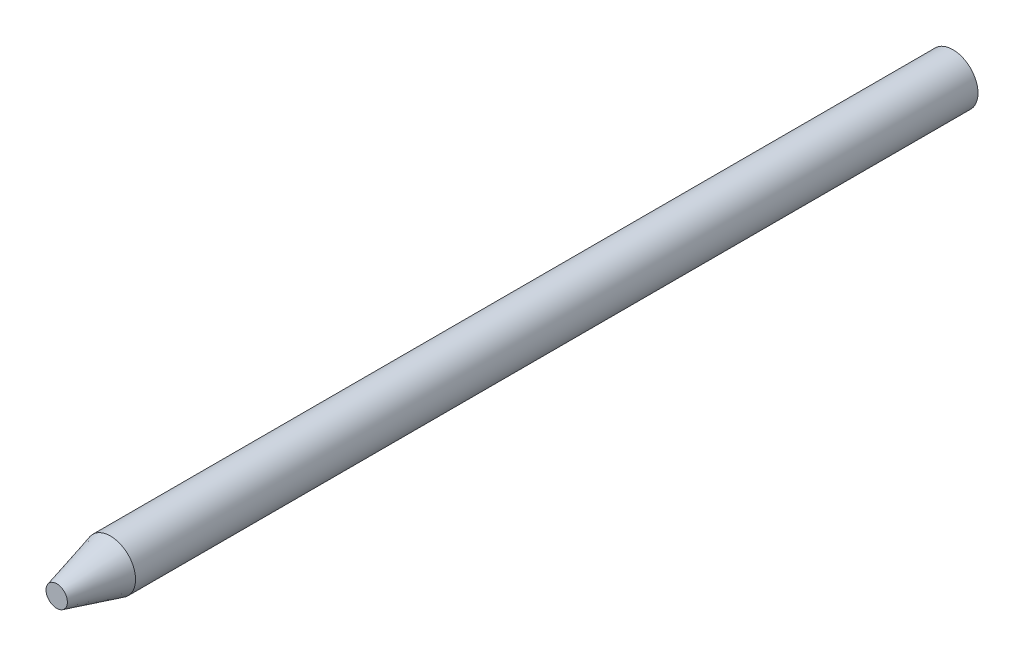
ISO-10303-21;
HEADER;
FILE_DESCRIPTION(('STEP AP214'),'2;1');
FILE_NAME('part.step','',(''),(''),'','','');
FILE_SCHEMA(('AUTOMOTIVE_DESIGN { 1 0 10303 214 1 1 1 1 }'));
ENDSEC;
DATA;
#1=APPLICATION_CONTEXT('core data for automotive mechanical design processes');
#2=APPLICATION_PROTOCOL_DEFINITION('international standard','automotive_design',2000,#1);
#3=PRODUCT_CONTEXT('',#1,'mechanical');
#4=PRODUCT('Part','Part','',(#3));
#5=PRODUCT_RELATED_PRODUCT_CATEGORY('part','',(#4));
#6=PRODUCT_DEFINITION_FORMATION('','',#4);
#7=PRODUCT_DEFINITION_CONTEXT('part definition',#1,'design');
#8=PRODUCT_DEFINITION('design','',#6,#7);
#9=PRODUCT_DEFINITION_SHAPE('','',#8);
#10=(LENGTH_UNIT() NAMED_UNIT(*) SI_UNIT(.MILLI.,.METRE.));
#11=(NAMED_UNIT(*) PLANE_ANGLE_UNIT() SI_UNIT($,.RADIAN.));
#12=(NAMED_UNIT(*) SI_UNIT($,.STERADIAN.) SOLID_ANGLE_UNIT());
#13=UNCERTAINTY_MEASURE_WITH_UNIT(LENGTH_MEASURE(1.E-05),#10,'distance_accuracy_value','');
#14=(GEOMETRIC_REPRESENTATION_CONTEXT(3) GLOBAL_UNCERTAINTY_ASSIGNED_CONTEXT((#13)) GLOBAL_UNIT_ASSIGNED_CONTEXT((#10,
#11,#12)) REPRESENTATION_CONTEXT('',''));
#15=CARTESIAN_POINT('',(0.,0.,0.));
#16=DIRECTION('',(0.,0.,1.));
#17=DIRECTION('',(1.,0.,0.));
#18=AXIS2_PLACEMENT_3D('',#15,#16,#17);
#19=CARTESIAN_POINT('',(0.,0.,63.5));
#20=DIRECTION('',(0.,0.,-1.));
#21=DIRECTION('',(-1.,0.,0.));
#22=AXIS2_PLACEMENT_3D('',#19,#20,#21);
#23=CYLINDRICAL_SURFACE('',#22,1.778);
#24=CARTESIAN_POINT('',(0.,0.,59.6899999999999));
#25=DIRECTION('',(0.,0.,1.));
#26=DIRECTION('',(1.,0.,0.));
#27=AXIS2_PLACEMENT_3D('',#24,#25,#26);
#28=CIRCLE('',#27,1.778);
#29=CARTESIAN_POINT('',(-1.778,0.,59.6899999999999));
#30=VERTEX_POINT('',#29);
#31=EDGE_CURVE('E10',#30,#30,#28,.F.);
#32=ORIENTED_EDGE('',*,*,#31,.T.);
#33=EDGE_LOOP('',(#32));
#34=FACE_BOUND('',#33,.T.);
#35=CARTESIAN_POINT('',(0.,0.,0.));
#36=DIRECTION('',(0.,0.,1.));
#37=DIRECTION('',(1.,0.,0.));
#38=AXIS2_PLACEMENT_3D('',#35,#36,#37);
#39=CIRCLE('',#38,1.778);
#40=CARTESIAN_POINT('',(1.778,0.,0.));
#41=VERTEX_POINT('',#40);
#42=EDGE_CURVE('E42',#41,#41,#39,.T.);
#43=ORIENTED_EDGE('',*,*,#42,.T.);
#44=EDGE_LOOP('',(#43));
#45=FACE_BOUND('',#44,.T.);
#46=ADVANCED_FACE('F31',(#34,#45),#23,.T.);
#47=CARTESIAN_POINT('',(0.,0.,63.5));
#48=DIRECTION('',(0.,0.,1.));
#49=DIRECTION('',(1.,0.,0.));
#50=AXIS2_PLACEMENT_3D('',#47,#48,#49);
#51=PLANE('',#50);
#52=CARTESIAN_POINT('',(0.,0.,63.5));
#53=DIRECTION('',(0.,0.,1.));
#54=DIRECTION('',(1.,0.,0.));
#55=AXIS2_PLACEMENT_3D('',#52,#53,#54);
#56=CIRCLE('',#55,0.757113576837398);
#57=CARTESIAN_POINT('',(-0.757113576837399,0.,63.5));
#58=VERTEX_POINT('',#57);
#59=EDGE_CURVE('E38',#58,#58,#56,.T.);
#60=ORIENTED_EDGE('',*,*,#59,.T.);
#61=EDGE_LOOP('',(#60));
#62=FACE_BOUND('',#61,.T.);
#63=ADVANCED_FACE('F52',(#62),#51,.T.);
#64=CARTESIAN_POINT('',(0.,0.,0.));
#65=DIRECTION('',(0.,0.,1.));
#66=DIRECTION('',(1.,0.,0.));
#67=AXIS2_PLACEMENT_3D('',#64,#65,#66);
#68=PLANE('',#67);
#69=ORIENTED_EDGE('',*,*,#42,.F.);
#70=EDGE_LOOP('',(#69));
#71=FACE_BOUND('',#70,.T.);
#72=ADVANCED_FACE('F50',(#71),#68,.F.);
#73=CARTESIAN_POINT('',(0.,0.,63.5));
#74=DIRECTION('',(0.,0.,-1.));
#75=DIRECTION('',(-1.,0.,0.));
#76=AXIS2_PLACEMENT_3D('',#73,#74,#75);
#77=CONICAL_SURFACE('',#76,0.757113576837398,0.261799387799147);
#78=CARTESIAN_POINT('',(-1.778,0.,59.6899999999999));
#79=CARTESIAN_POINT('',(-1.76736576642539,0.,59.7296874999999));
#80=CARTESIAN_POINT('',(-1.75673153285078,0.,59.7693749999999));
#81=CARTESIAN_POINT('',(-1.73546306570156,0.,59.8487499999999));
#82=CARTESIAN_POINT('',(-1.72482883212695,0.,59.8884374999999));
#83=CARTESIAN_POINT('',(-1.70356036497773,0.,59.9678124999999));
#84=CARTESIAN_POINT('',(-1.69292613140312,0.,60.0074999999999));
#85=CARTESIAN_POINT('',(-1.6716576642539,0.,60.0868749999999));
#86=CARTESIAN_POINT('',(-1.66102343067929,0.,60.1265624999999));
#87=CARTESIAN_POINT('',(-1.63975496353007,0.,60.2059374999999));
#88=CARTESIAN_POINT('',(-1.62912072995546,0.,60.2456249999999));
#89=CARTESIAN_POINT('',(-1.60785226280623,0.,60.3249999999999));
#90=CARTESIAN_POINT('',(-1.59721802923162,0.,60.3646874999999));
#91=CARTESIAN_POINT('',(-1.5759495620824,0.,60.4440624999999));
#92=CARTESIAN_POINT('',(-1.56531532850779,0.,60.4837499999999));
#93=CARTESIAN_POINT('',(-1.54404686135857,0.,60.5631249999999));
#94=CARTESIAN_POINT('',(-1.53341262778396,0.,60.6028124999999));
#95=CARTESIAN_POINT('',(-1.51214416063474,0.,60.6821874999999));
#96=CARTESIAN_POINT('',(-1.50150992706013,0.,60.7218749999999));
#97=CARTESIAN_POINT('',(-1.48024145991091,0.,60.8012499999999));
#98=CARTESIAN_POINT('',(-1.4696072263363,0.,60.8409374999999));
#99=CARTESIAN_POINT('',(-1.44833875918708,0.,60.9203124999999));
#100=CARTESIAN_POINT('',(-1.43770452561247,0.,60.9599999999999));
#101=CARTESIAN_POINT('',(-1.41643605846325,0.,61.0393749999999));
#102=CARTESIAN_POINT('',(-1.40580182488864,0.,61.0790624999999));
#103=CARTESIAN_POINT('',(-1.38453335773942,0.,61.1584374999999));
#104=CARTESIAN_POINT('',(-1.3738991241648,0.,61.1981249999999));
#105=CARTESIAN_POINT('',(-1.35263065701558,0.,61.2774999999999));
#106=CARTESIAN_POINT('',(-1.34199642344097,0.,61.3171874999999));
#107=CARTESIAN_POINT('',(-1.32072795629175,0.,61.3965624999999));
#108=CARTESIAN_POINT('',(-1.31009372271714,0.,61.4362499999999));
#109=CARTESIAN_POINT('',(-1.28882525556792,0.,61.5156249999999));
#110=CARTESIAN_POINT('',(-1.27819102199331,0.,61.5553124999999));
#111=CARTESIAN_POINT('',(-1.25692255484409,0.,61.6346874999999));
#112=CARTESIAN_POINT('',(-1.24628832126948,0.,61.6743749999999));
#113=CARTESIAN_POINT('',(-1.22501985412026,0.,61.7537499999999));
#114=CARTESIAN_POINT('',(-1.21438562054565,0.,61.7934374999999));
#115=CARTESIAN_POINT('',(-1.19311715339643,0.,61.8728124999999));
#116=CARTESIAN_POINT('',(-1.18248291982182,0.,61.9124999999999));
#117=CARTESIAN_POINT('',(-1.1612144526726,0.,61.9918749999999));
#118=CARTESIAN_POINT('',(-1.15058021909799,0.,62.0315624999999));
#119=CARTESIAN_POINT('',(-1.12931175194876,0.,62.1109374999999));
#120=CARTESIAN_POINT('',(-1.11867751837415,0.,62.1506249999999));
#121=CARTESIAN_POINT('',(-1.09740905122493,0.,62.23));
#122=CARTESIAN_POINT('',(-1.08677481765032,0.,62.2696875));
#123=CARTESIAN_POINT('',(-1.0655063505011,0.,62.3490625));
#124=CARTESIAN_POINT('',(-1.05487211692649,0.,62.38875));
#125=CARTESIAN_POINT('',(-1.03360364977727,0.,62.468125));
#126=CARTESIAN_POINT('',(-1.02296941620266,0.,62.5078125));
#127=CARTESIAN_POINT('',(-1.00170094905344,0.,62.5871875));
#128=CARTESIAN_POINT('',(-0.991066715478829,0.,62.626875));
#129=CARTESIAN_POINT('',(-0.969798248329608,0.,62.70625));
#130=CARTESIAN_POINT('',(-0.959164014754998,0.,62.7459375));
#131=CARTESIAN_POINT('',(-0.937895547605777,0.,62.8253125));
#132=CARTESIAN_POINT('',(-0.927261314031166,0.,62.865));
#133=CARTESIAN_POINT('',(-0.905992846881945,0.,62.944375));
#134=CARTESIAN_POINT('',(-0.895358613307335,0.,62.9840625));
#135=CARTESIAN_POINT('',(-0.874090146158114,0.,63.0634375));
#136=CARTESIAN_POINT('',(-0.863455912583504,0.,63.103125));
#137=CARTESIAN_POINT('',(-0.842187445434283,0.,63.1825));
#138=CARTESIAN_POINT('',(-0.831553211859672,0.,63.2221875));
#139=CARTESIAN_POINT('',(-0.810284744710451,0.,63.3015625));
#140=CARTESIAN_POINT('',(-0.799650511135841,0.,63.34125));
#141=CARTESIAN_POINT('',(-0.778382043986619,0.,63.420625));
#142=CARTESIAN_POINT('',(-0.767747810412009,0.,63.4603125));
#143=CARTESIAN_POINT('',(-0.757113576837399,0.,63.5));
#144=B_SPLINE_CURVE_WITH_KNOTS('',3,(#78,#79,#80,#81,#82,#83,#84,#85,#86,#87,#88,#89,#90,#91,
#92,#93,#94,#95,#96,#97,#98,#99,#100,#101,#102,#103,#104,#105,#106,#107,#108,#109,#110,#111,
#112,#113,#114,#115,#116,#117,#118,#119,#120,#121,#122,#123,#124,#125,#126,#127,#128,#129,#130,
#131,#132,#133,#134,#135,#136,#137,#138,#139,#140,#141,#142,#143),.UNSPECIFIED.,.F.,.F.,(4,2,2,
2,2,2,2,2,2,2,2,2,2,2,2,2,2,2,2,2,2,2,2,2,2,2,2,2,2,2,2,2,4),(0.,0.123262570230078,
0.246525140460157,0.369787710690235,0.493050280920314,0.616312851150392,0.739575421380471,
0.862837991610556,0.986100561840635,1.10936313207071,1.23262570230079,1.35588827253087,
1.47915084276095,1.60241341299103,1.72567598322111,1.84893855345119,1.97220112368127,
2.09546369391135,2.21872626414143,2.3419888343715,2.46525140460158,2.58851397483166,
2.71177654506175,2.83503911529182,2.9583016855219,3.08156425575198,3.20482682598206,
3.32808939621214,3.45135196644222,3.57461453667229,3.69787710690237,3.82113967713245,
3.94440224736254),.UNSPECIFIED.);
#145=EDGE_CURVE('BSEAM33',#30,#58,#144,.T.);
#146=ORIENTED_EDGE('',*,*,#31,.F.);
#147=ORIENTED_EDGE('',*,*,#59,.F.);
#148=ORIENTED_EDGE('',*,*,#145,.T.);
#149=ORIENTED_EDGE('',*,*,#145,.F.);
#150=EDGE_LOOP('',(#146,#148,#147,#149));
#151=FACE_BOUND('',#150,.T.);
#152=ADVANCED_FACE('F33',(#151),#77,.T.);
#153=CLOSED_SHELL('',(#46,#63,#72,#152));
#154=MANIFOLD_SOLID_BREP('B2',#153);
#155=ADVANCED_BREP_SHAPE_REPRESENTATION('',(#18,#154),#14);
#156=SHAPE_DEFINITION_REPRESENTATION(#9,#155);
ENDSEC;
END-ISO-10303-21;
